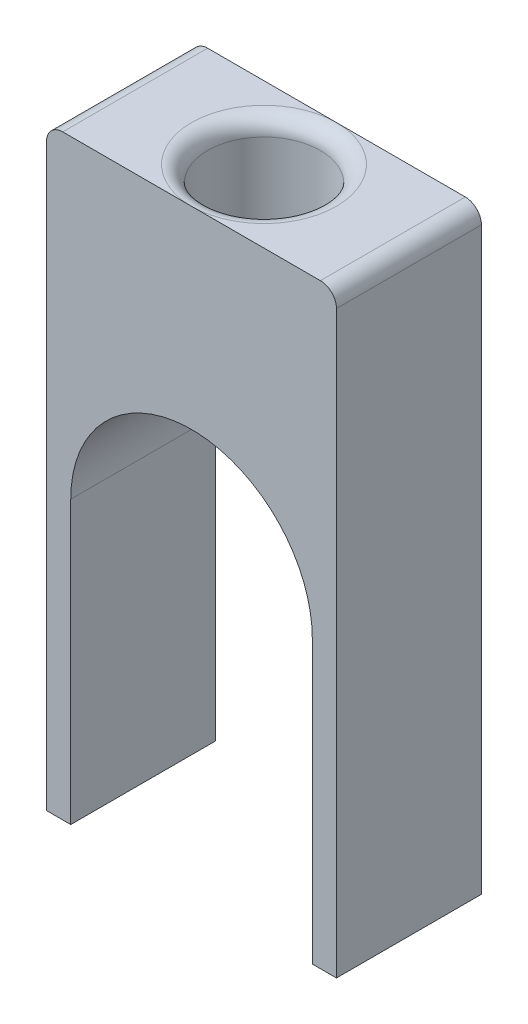
ISO-10303-21;
HEADER;
FILE_DESCRIPTION(('STEP AP214'),'2;1');
FILE_NAME('part.step','',(''),(''),'','','');
FILE_SCHEMA(('AUTOMOTIVE_DESIGN { 1 0 10303 214 1 1 1 1 }'));
ENDSEC;
DATA;
#1=APPLICATION_CONTEXT('core data for automotive mechanical design processes');
#2=APPLICATION_PROTOCOL_DEFINITION('international standard','automotive_design',2000,#1);
#3=PRODUCT_CONTEXT('',#1,'mechanical');
#4=PRODUCT('Part','Part','',(#3));
#5=PRODUCT_RELATED_PRODUCT_CATEGORY('part','',(#4));
#6=PRODUCT_DEFINITION_FORMATION('','',#4);
#7=PRODUCT_DEFINITION_CONTEXT('part definition',#1,'design');
#8=PRODUCT_DEFINITION('design','',#6,#7);
#9=PRODUCT_DEFINITION_SHAPE('','',#8);
#10=(LENGTH_UNIT() NAMED_UNIT(*) SI_UNIT(.MILLI.,.METRE.));
#11=(NAMED_UNIT(*) PLANE_ANGLE_UNIT() SI_UNIT($,.RADIAN.));
#12=(NAMED_UNIT(*) SI_UNIT($,.STERADIAN.) SOLID_ANGLE_UNIT());
#13=UNCERTAINTY_MEASURE_WITH_UNIT(LENGTH_MEASURE(1.E-05),#10,'distance_accuracy_value','');
#14=(GEOMETRIC_REPRESENTATION_CONTEXT(3) GLOBAL_UNCERTAINTY_ASSIGNED_CONTEXT((#13)) GLOBAL_UNIT_ASSIGNED_CONTEXT((#10,
#11,#12)) REPRESENTATION_CONTEXT('',''));
#15=CARTESIAN_POINT('',(0.,0.,0.));
#16=DIRECTION('',(0.,0.,1.));
#17=DIRECTION('',(1.,0.,0.));
#18=AXIS2_PLACEMENT_3D('',#15,#16,#17);
#19=CARTESIAN_POINT('',(0.,74.,18.));
#20=DIRECTION('',(0.,1.,0.));
#21=DIRECTION('',(0.,0.,1.));
#22=AXIS2_PLACEMENT_3D('',#19,#20,#21);
#23=PLANE('',#22);
#24=DIRECTION('',(1.,0.,0.));
#25=VECTOR('',#24,1.);
#26=CARTESIAN_POINT('',(0.,74.,0.));
#27=LINE('',#26,#25);
#28=CARTESIAN_POINT('',(-34.,74.,0.));
#29=VERTEX_POINT('',#28);
#30=CARTESIAN_POINT('',(-18.,74.,0.));
#31=VERTEX_POINT('',#30);
#32=EDGE_CURVE('E172',#29,#31,#27,.T.);
#33=ORIENTED_EDGE('',*,*,#32,.F.);
#34=DIRECTION('',(0.,0.,-1.));
#35=VECTOR('',#34,1.);
#36=CARTESIAN_POINT('',(-34.,74.,18.));
#37=LINE('',#36,#35);
#38=CARTESIAN_POINT('',(-34.,74.,18.));
#39=VERTEX_POINT('',#38);
#40=EDGE_CURVE('E12',#29,#39,#37,.F.);
#41=ORIENTED_EDGE('',*,*,#40,.T.);
#42=DIRECTION('',(1.,0.,0.));
#43=VECTOR('',#42,1.);
#44=CARTESIAN_POINT('',(0.,74.,18.));
#45=LINE('',#44,#43);
#46=CARTESIAN_POINT('',(-18.,74.,18.));
#47=VERTEX_POINT('',#46);
#48=EDGE_CURVE('E177',#39,#47,#45,.T.);
#49=ORIENTED_EDGE('',*,*,#48,.T.);
#50=CARTESIAN_POINT('',(-18.,74.,9.));
#51=DIRECTION('',(0.,1.,0.));
#52=DIRECTION('',(0.,0.,1.));
#53=AXIS2_PLACEMENT_3D('',#50,#51,#52);
#54=CIRCLE('',#53,9.);
#55=EDGE_CURVE('E200',#47,#31,#54,.F.);
#56=ORIENTED_EDGE('',*,*,#55,.T.);
#57=EDGE_LOOP('',(#33,#41,#49,#56));
#58=FACE_BOUND('',#57,.T.);
#59=ADVANCED_FACE('F59',(#58),#23,.T.);
#60=CARTESIAN_POINT('',(0.,0.,18.));
#61=DIRECTION('',(0.,1.,0.));
#62=DIRECTION('',(0.,0.,1.));
#63=AXIS2_PLACEMENT_3D('',#60,#61,#62);
#64=PLANE('',#63);
#65=DIRECTION('',(0.,0.,-1.));
#66=VECTOR('',#65,1.);
#67=CARTESIAN_POINT('',(-33.,0.,18.));
#68=LINE('',#67,#66);
#69=CARTESIAN_POINT('',(-33.,0.,18.));
#70=VERTEX_POINT('',#69);
#71=CARTESIAN_POINT('',(-33.,0.,0.));
#72=VERTEX_POINT('',#71);
#73=EDGE_CURVE('E152',#70,#72,#68,.T.);
#74=ORIENTED_EDGE('',*,*,#73,.F.);
#75=DIRECTION('',(1.,0.,0.));
#76=VECTOR('',#75,1.);
#77=CARTESIAN_POINT('',(0.,0.,18.));
#78=LINE('',#77,#76);
#79=CARTESIAN_POINT('',(-36.,0.,18.));
#80=VERTEX_POINT('',#79);
#81=EDGE_CURVE('E167',#80,#70,#78,.T.);
#82=ORIENTED_EDGE('',*,*,#81,.F.);
#83=DIRECTION('',(0.,0.,-1.));
#84=VECTOR('',#83,1.);
#85=CARTESIAN_POINT('',(-36.,0.,18.));
#86=LINE('',#85,#84);
#87=CARTESIAN_POINT('',(-36.,0.,0.));
#88=VERTEX_POINT('',#87);
#89=EDGE_CURVE('E191',#80,#88,#86,.T.);
#90=ORIENTED_EDGE('',*,*,#89,.T.);
#91=DIRECTION('',(1.,0.,0.));
#92=VECTOR('',#91,1.);
#93=CARTESIAN_POINT('',(0.,0.,0.));
#94=LINE('',#93,#92);
#95=EDGE_CURVE('E183',#88,#72,#94,.T.);
#96=ORIENTED_EDGE('',*,*,#95,.T.);
#97=EDGE_LOOP('',(#74,#82,#90,#96));
#98=FACE_BOUND('',#97,.T.);
#99=ADVANCED_FACE('F232',(#98),#64,.F.);
#100=CARTESIAN_POINT('',(-36.,0.,18.));
#101=DIRECTION('',(1.,0.,0.));
#102=DIRECTION('',(0.,0.,-1.));
#103=AXIS2_PLACEMENT_3D('',#100,#101,#102);
#104=PLANE('',#103);
#105=DIRECTION('',(0.,-1.,0.));
#106=VECTOR('',#105,1.);
#107=CARTESIAN_POINT('',(-36.,0.,18.));
#108=LINE('',#107,#106);
#109=CARTESIAN_POINT('',(-36.,72.,18.));
#110=VERTEX_POINT('',#109);
#111=EDGE_CURVE('E168',#110,#80,#108,.T.);
#112=ORIENTED_EDGE('',*,*,#111,.F.);
#113=DIRECTION('',(0.,0.,-1.));
#114=VECTOR('',#113,1.);
#115=CARTESIAN_POINT('',(-36.,72.,0.));
#116=LINE('',#115,#114);
#117=CARTESIAN_POINT('',(-36.,72.,0.));
#118=VERTEX_POINT('',#117);
#119=EDGE_CURVE('E67',#110,#118,#116,.T.);
#120=ORIENTED_EDGE('',*,*,#119,.T.);
#121=DIRECTION('',(0.,-1.,0.));
#122=VECTOR('',#121,1.);
#123=CARTESIAN_POINT('',(-36.,0.,0.));
#124=LINE('',#123,#122);
#125=EDGE_CURVE('E179',#118,#88,#124,.T.);
#126=ORIENTED_EDGE('',*,*,#125,.T.);
#127=ORIENTED_EDGE('',*,*,#89,.F.);
#128=EDGE_LOOP('',(#112,#120,#126,#127));
#129=FACE_BOUND('',#128,.T.);
#130=ADVANCED_FACE('F218',(#129),#104,.F.);
#131=CARTESIAN_POINT('',(-3.00000000000001,0.,18.));
#132=VERTEX_POINT('',#131);
#133=CARTESIAN_POINT('',(0.,0.,18.));
#134=VERTEX_POINT('',#133);
#135=EDGE_CURVE('E158',#132,#134,#78,.T.);
#136=ORIENTED_EDGE('',*,*,#135,.F.);
#137=DIRECTION('',(0.,0.,-1.));
#138=VECTOR('',#137,1.);
#139=CARTESIAN_POINT('',(-3.00000000000001,0.,18.));
#140=LINE('',#139,#138);
#141=CARTESIAN_POINT('',(-3.00000000000001,0.,0.));
#142=VERTEX_POINT('',#141);
#143=EDGE_CURVE('E141',#132,#142,#140,.T.);
#144=ORIENTED_EDGE('',*,*,#143,.T.);
#145=CARTESIAN_POINT('',(0.,0.,0.));
#146=VERTEX_POINT('',#145);
#147=EDGE_CURVE('E181',#142,#146,#94,.T.);
#148=ORIENTED_EDGE('',*,*,#147,.T.);
#149=DIRECTION('',(0.,0.,-1.));
#150=VECTOR('',#149,1.);
#151=CARTESIAN_POINT('',(0.,0.,18.));
#152=LINE('',#151,#150);
#153=EDGE_CURVE('E166',#134,#146,#152,.T.);
#154=ORIENTED_EDGE('',*,*,#153,.F.);
#155=EDGE_LOOP('',(#136,#144,#148,#154));
#156=FACE_BOUND('',#155,.T.);
#157=ADVANCED_FACE('F164',(#156),#64,.F.);
#158=CARTESIAN_POINT('',(0.,0.,18.));
#159=DIRECTION('',(1.,0.,0.));
#160=DIRECTION('',(0.,0.,-1.));
#161=AXIS2_PLACEMENT_3D('',#158,#159,#160);
#162=PLANE('',#161);
#163=DIRECTION('',(0.,-1.,0.));
#164=VECTOR('',#163,1.);
#165=CARTESIAN_POINT('',(0.,0.,0.));
#166=LINE('',#165,#164);
#167=CARTESIAN_POINT('',(0.,72.,0.));
#168=VERTEX_POINT('',#167);
#169=EDGE_CURVE('E186',#168,#146,#166,.T.);
#170=ORIENTED_EDGE('',*,*,#169,.F.);
#171=DIRECTION('',(0.,0.,-1.));
#172=VECTOR('',#171,1.);
#173=CARTESIAN_POINT('',(0.,72.,18.));
#174=LINE('',#173,#172);
#175=CARTESIAN_POINT('',(0.,72.,18.));
#176=VERTEX_POINT('',#175);
#177=EDGE_CURVE('E210',#168,#176,#174,.F.);
#178=ORIENTED_EDGE('',*,*,#177,.T.);
#179=DIRECTION('',(0.,-1.,0.));
#180=VECTOR('',#179,1.);
#181=CARTESIAN_POINT('',(0.,0.,18.));
#182=LINE('',#181,#180);
#183=EDGE_CURVE('E171',#176,#134,#182,.T.);
#184=ORIENTED_EDGE('',*,*,#183,.T.);
#185=ORIENTED_EDGE('',*,*,#153,.T.);
#186=EDGE_LOOP('',(#170,#178,#184,#185));
#187=FACE_BOUND('',#186,.T.);
#188=ADVANCED_FACE('F274',(#187),#162,.T.);
#189=CARTESIAN_POINT('',(-2.,74.,18.));
#190=VERTEX_POINT('',#189);
#191=EDGE_CURVE('E176',#47,#190,#45,.T.);
#192=ORIENTED_EDGE('',*,*,#191,.T.);
#193=DIRECTION('',(0.,0.,-1.));
#194=VECTOR('',#193,1.);
#195=CARTESIAN_POINT('',(-2.,74.,18.));
#196=LINE('',#195,#194);
#197=CARTESIAN_POINT('',(-2.,74.,0.));
#198=VERTEX_POINT('',#197);
#199=EDGE_CURVE('E203',#190,#198,#196,.T.);
#200=ORIENTED_EDGE('',*,*,#199,.T.);
#201=EDGE_CURVE('E188',#31,#198,#27,.T.);
#202=ORIENTED_EDGE('',*,*,#201,.F.);
#203=CARTESIAN_POINT('',(-18.,74.,9.));
#204=DIRECTION('',(0.,1.,0.));
#205=DIRECTION('',(0.,0.,1.));
#206=AXIS2_PLACEMENT_3D('',#203,#204,#205);
#207=CIRCLE('',#206,9.);
#208=EDGE_CURVE('E197',#31,#47,#207,.F.);
#209=ORIENTED_EDGE('',*,*,#208,.T.);
#210=EDGE_LOOP('',(#192,#200,#202,#209));
#211=FACE_BOUND('',#210,.T.);
#212=ADVANCED_FACE('F264',(#211),#23,.T.);
#213=CARTESIAN_POINT('',(0.,0.,18.));
#214=DIRECTION('',(0.,0.,1.));
#215=DIRECTION('',(1.,0.,0.));
#216=AXIS2_PLACEMENT_3D('',#213,#214,#215);
#217=PLANE('',#216);
#218=ORIENTED_EDGE('',*,*,#183,.F.);
#219=CARTESIAN_POINT('',(-2.,72.,18.));
#220=DIRECTION('',(0.,0.,1.));
#221=DIRECTION('',(1.,0.,0.));
#222=AXIS2_PLACEMENT_3D('',#219,#220,#221);
#223=CIRCLE('',#222,2.);
#224=EDGE_CURVE('E213',#176,#190,#223,.T.);
#225=ORIENTED_EDGE('',*,*,#224,.T.);
#226=ORIENTED_EDGE('',*,*,#191,.F.);
#227=ORIENTED_EDGE('',*,*,#48,.F.);
#228=CARTESIAN_POINT('',(-34.,72.,18.));
#229=DIRECTION('',(0.,0.,1.));
#230=DIRECTION('',(1.,0.,0.));
#231=AXIS2_PLACEMENT_3D('',#228,#229,#230);
#232=CIRCLE('',#231,2.);
#233=EDGE_CURVE('E74',#39,#110,#232,.T.);
#234=ORIENTED_EDGE('',*,*,#233,.T.);
#235=ORIENTED_EDGE('',*,*,#111,.T.);
#236=ORIENTED_EDGE('',*,*,#81,.T.);
#237=DIRECTION('',(0.,-1.,0.));
#238=VECTOR('',#237,1.);
#239=CARTESIAN_POINT('',(-33.,35.,18.));
#240=LINE('',#239,#238);
#241=CARTESIAN_POINT('',(-33.,35.,18.));
#242=VERTEX_POINT('',#241);
#243=EDGE_CURVE('E161',#242,#70,#240,.T.);
#244=ORIENTED_EDGE('',*,*,#243,.F.);
#245=CARTESIAN_POINT('',(-18.,35.,18.));
#246=DIRECTION('',(0.,0.,1.));
#247=DIRECTION('',(1.,0.,0.));
#248=AXIS2_PLACEMENT_3D('',#245,#246,#247);
#249=CIRCLE('',#248,15.);
#250=CARTESIAN_POINT('',(-3.00000000000001,35.,18.));
#251=VERTEX_POINT('',#250);
#252=EDGE_CURVE('E153',#251,#242,#249,.T.);
#253=ORIENTED_EDGE('',*,*,#252,.F.);
#254=DIRECTION('',(0.,-1.,0.));
#255=VECTOR('',#254,1.);
#256=CARTESIAN_POINT('',(-3.00000000000001,35.,18.));
#257=LINE('',#256,#255);
#258=EDGE_CURVE('E144',#251,#132,#257,.T.);
#259=ORIENTED_EDGE('',*,*,#258,.T.);
#260=ORIENTED_EDGE('',*,*,#135,.T.);
#261=EDGE_LOOP('',(#218,#225,#226,#227,#234,#235,#236,#244,#253,#259,#260));
#262=FACE_BOUND('',#261,.T.);
#263=ADVANCED_FACE('F157',(#262),#217,.T.);
#264=CARTESIAN_POINT('',(0.,0.,0.));
#265=DIRECTION('',(0.,0.,1.));
#266=DIRECTION('',(1.,0.,0.));
#267=AXIS2_PLACEMENT_3D('',#264,#265,#266);
#268=PLANE('',#267);
#269=ORIENTED_EDGE('',*,*,#201,.T.);
#270=CARTESIAN_POINT('',(-2.,72.,0.));
#271=DIRECTION('',(0.,0.,1.));
#272=DIRECTION('',(1.,0.,0.));
#273=AXIS2_PLACEMENT_3D('',#270,#271,#272);
#274=CIRCLE('',#273,2.);
#275=EDGE_CURVE('E208',#198,#168,#274,.F.);
#276=ORIENTED_EDGE('',*,*,#275,.T.);
#277=ORIENTED_EDGE('',*,*,#169,.T.);
#278=ORIENTED_EDGE('',*,*,#147,.F.);
#279=DIRECTION('',(0.,-1.,0.));
#280=VECTOR('',#279,1.);
#281=CARTESIAN_POINT('',(-3.00000000000001,35.,0.));
#282=LINE('',#281,#280);
#283=CARTESIAN_POINT('',(-3.00000000000001,35.,0.));
#284=VERTEX_POINT('',#283);
#285=EDGE_CURVE('E147',#284,#142,#282,.T.);
#286=ORIENTED_EDGE('',*,*,#285,.F.);
#287=CARTESIAN_POINT('',(-18.,35.,0.));
#288=DIRECTION('',(0.,0.,1.));
#289=DIRECTION('',(1.,0.,0.));
#290=AXIS2_PLACEMENT_3D('',#287,#288,#289);
#291=CIRCLE('',#290,15.);
#292=CARTESIAN_POINT('',(-33.,35.,0.));
#293=VERTEX_POINT('',#292);
#294=EDGE_CURVE('E162',#284,#293,#291,.T.);
#295=ORIENTED_EDGE('',*,*,#294,.T.);
#296=DIRECTION('',(0.,-1.,0.));
#297=VECTOR('',#296,1.);
#298=CARTESIAN_POINT('',(-33.,35.,0.));
#299=LINE('',#298,#297);
#300=EDGE_CURVE('E228',#293,#72,#299,.T.);
#301=ORIENTED_EDGE('',*,*,#300,.T.);
#302=ORIENTED_EDGE('',*,*,#95,.F.);
#303=ORIENTED_EDGE('',*,*,#125,.F.);
#304=CARTESIAN_POINT('',(-34.,72.,0.));
#305=DIRECTION('',(0.,0.,1.));
#306=DIRECTION('',(1.,0.,0.));
#307=AXIS2_PLACEMENT_3D('',#304,#305,#306);
#308=CIRCLE('',#307,2.);
#309=EDGE_CURVE('E206',#118,#29,#308,.F.);
#310=ORIENTED_EDGE('',*,*,#309,.T.);
#311=ORIENTED_EDGE('',*,*,#32,.T.);
#312=EDGE_LOOP('',(#269,#276,#277,#278,#286,#295,#301,#302,#303,#310,#311));
#313=FACE_BOUND('',#312,.T.);
#314=ADVANCED_FACE('F224',(#313),#268,.F.);
#315=CARTESIAN_POINT('',(-3.00000000000001,35.,18.));
#316=DIRECTION('',(1.,0.,0.));
#317=DIRECTION('',(0.,0.,-1.));
#318=AXIS2_PLACEMENT_3D('',#315,#316,#317);
#319=PLANE('',#318);
#320=ORIENTED_EDGE('',*,*,#285,.T.);
#321=ORIENTED_EDGE('',*,*,#143,.F.);
#322=ORIENTED_EDGE('',*,*,#258,.F.);
#323=DIRECTION('',(0.,0.,-1.));
#324=VECTOR('',#323,1.);
#325=CARTESIAN_POINT('',(-3.00000000000001,35.,18.));
#326=LINE('',#325,#324);
#327=EDGE_CURVE('E182',#251,#284,#326,.T.);
#328=ORIENTED_EDGE('',*,*,#327,.T.);
#329=EDGE_LOOP('',(#320,#321,#322,#328));
#330=FACE_BOUND('',#329,.T.);
#331=ADVANCED_FACE('F143',(#330),#319,.F.);
#332=CARTESIAN_POINT('',(-18.,35.,18.));
#333=DIRECTION('',(0.,0.,-1.));
#334=DIRECTION('',(-1.,0.,0.));
#335=AXIS2_PLACEMENT_3D('',#332,#333,#334);
#336=CYLINDRICAL_SURFACE('',#335,15.);
#337=CARTESIAN_POINT('',(-18.,50.,16.));
#338=CARTESIAN_POINT('',(-17.8144724903543,49.9999989062768,15.9999987311845));
#339=CARTESIAN_POINT('',(-17.6289108404347,49.9965492462378,15.9926149496319));
#340=CARTESIAN_POINT('',(-17.259135311178,49.9828363155982,15.963156568287));
#341=CARTESIAN_POINT('',(-17.0749221814709,49.9725695089819,15.9410743444807));
#342=CARTESIAN_POINT('',(-16.7089841349934,49.9454673410377,15.8824175764527));
#343=CARTESIAN_POINT('',(-16.5272640099452,49.928620781231,15.8458183231612));
#344=CARTESIAN_POINT('',(-16.1678623326587,49.8887870557922,15.7585122416939));
#345=CARTESIAN_POINT('',(-15.9901824650756,49.8657973778409,15.7077996413029));
#346=CARTESIAN_POINT('',(-15.6408411168908,49.8143651145563,15.5930291161196));
#347=CARTESIAN_POINT('',(-15.4691577014083,49.7859455779182,15.5290275043861));
#348=CARTESIAN_POINT('',(-15.1320074611391,49.7242659158824,15.3881154617424));
#349=CARTESIAN_POINT('',(-14.9665430296055,49.6910039504898,15.3112001222469));
#350=CARTESIAN_POINT('',(-14.6428928731725,49.6204390462863,15.1451512914262));
#351=CARTESIAN_POINT('',(-14.4847027443468,49.5831385995459,15.0560253261356));
#352=CARTESIAN_POINT('',(-14.1762576307084,49.5053212671914,14.8661597675412));
#353=CARTESIAN_POINT('',(-14.0260055707253,49.4648032096043,14.7654159364829));
#354=CARTESIAN_POINT('',(-13.5723982906027,49.3352174768163,14.4351670235891));
#355=CARTESIAN_POINT('',(-13.2837624770057,49.2420761526874,14.1866208200334));
#356=CARTESIAN_POINT('',(-12.7505628682364,49.0543075209071,13.6462489954088));
#357=CARTESIAN_POINT('',(-12.5060280884725,48.9596792791476,13.3543951093714));
#358=CARTESIAN_POINT('',(-12.1692458894956,48.8209401738483,12.8785879777553));
#359=CARTESIAN_POINT('',(-12.0591933743071,48.7738664925622,12.7078579282309));
#360=CARTESIAN_POINT('',(-11.8539814848708,48.6835306533337,12.3567480796531));
#361=CARTESIAN_POINT('',(-11.7588159187729,48.640266914032,12.1763723345952));
#362=CARTESIAN_POINT('',(-11.5842320056339,48.5590265354511,11.8070684944977));
#363=CARTESIAN_POINT('',(-11.5048095728275,48.5210485251475,11.6181426341175));
#364=CARTESIAN_POINT('',(-11.3625294491343,48.451775124541,11.2329619451478));
#365=CARTESIAN_POINT('',(-11.2996701711392,48.4204790940145,11.0367078208234));
#366=CARTESIAN_POINT('',(-11.1943291741414,48.3673531698136,10.6494932833254));
#367=CARTESIAN_POINT('',(-11.1509064716103,48.3450926725968,10.4588480946643));
#368=CARTESIAN_POINT('',(-11.0800897669681,48.308509999873,10.0738452185197));
#369=CARTESIAN_POINT('',(-11.0526951604446,48.2941875250276,9.87948767131311));
#370=CARTESIAN_POINT('',(-11.0143346001328,48.2740706095154,9.4888472013927));
#371=CARTESIAN_POINT('',(-11.0033576736239,48.268270473008,9.29256565297039));
#372=CARTESIAN_POINT('',(-10.9979628601536,48.2654245810255,8.89971851980438));
#373=CARTESIAN_POINT('',(-11.0035437268629,48.2683781666449,8.70315295755201));
#374=CARTESIAN_POINT('',(-11.0297749517005,48.2821739666281,8.33133975246732));
#375=CARTESIAN_POINT('',(-11.048844001363,48.2921880639042,8.15594684775974));
#376=CARTESIAN_POINT('',(-11.1000696671764,48.3188511388526,7.80753469158967));
#377=CARTESIAN_POINT('',(-11.132230683858,48.3355023473812,7.63451625847838));
#378=CARTESIAN_POINT('',(-11.2092830358291,48.3749029758743,7.29208944033967));
#379=CARTESIAN_POINT('',(-11.2541720309192,48.3976512747697,7.12268039783069));
#380=CARTESIAN_POINT('',(-11.3562560844524,48.4485656794008,6.78838761974696));
#381=CARTESIAN_POINT('',(-11.4134559396177,48.476733896463,6.62350567639755));
#382=CARTESIAN_POINT('',(-11.5410925981186,48.5383766583609,6.29552875500583));
#383=CARTESIAN_POINT('',(-11.6117997215619,48.5719568830626,6.13255870779857));
#384=CARTESIAN_POINT('',(-11.7649931003743,48.6430140070596,5.81313368756305));
#385=CARTESIAN_POINT('',(-11.847483297425,48.6804922091636,5.65668091741101));
#386=CARTESIAN_POINT('',(-12.111883257174,48.7973596666347,5.19810690542785));
#387=CARTESIAN_POINT('',(-12.3107856941847,48.8812136856748,4.90660842705447));
#388=CARTESIAN_POINT('',(-12.6513180373986,49.0145878791314,4.48008319514176));
#389=CARTESIAN_POINT('',(-12.7790245294469,49.062774006816,4.33316946029705));
#390=CARTESIAN_POINT('',(-13.0462296024235,49.1591066274215,4.0504618618073));
#391=CARTESIAN_POINT('',(-13.1857250243727,49.2072531274913,3.91466503833858));
#392=CARTESIAN_POINT('',(-13.4758823934247,49.3022965716615,3.65487840277979));
#393=CARTESIAN_POINT('',(-13.626552407589,49.3491925791524,3.53089727104321));
#394=CARTESIAN_POINT('',(-13.9381453655387,49.4404874529307,3.29566653621278));
#395=CARTESIAN_POINT('',(-14.0990642011653,49.4848873065116,3.18441188119369));
#396=CARTESIAN_POINT('',(-14.4363555064618,49.5716107423194,2.97159845626735));
#397=CARTESIAN_POINT('',(-14.6130765428049,49.6138009529048,2.87053656145541));
#398=CARTESIAN_POINT('',(-14.9754904734718,49.6930843662266,2.68384062940458));
#399=CARTESIAN_POINT('',(-15.1611793460062,49.7301798256273,2.59819975632945));
#400=CARTESIAN_POINT('',(-15.5402645986457,49.7982015015905,2.44320063761778));
#401=CARTESIAN_POINT('',(-15.7336584964581,49.8291296860587,2.37383719678827));
#402=CARTESIAN_POINT('',(-16.1267169396255,49.8838894885933,2.25217654360744));
#403=CARTESIAN_POINT('',(-16.3263808661658,49.9077218045617,2.19987765285264));
#404=CARTESIAN_POINT('',(-16.7150935708123,49.9460444220633,2.11628636906312));
#405=CARTESIAN_POINT('',(-16.9038108855109,49.9611026527104,2.08370962358555));
#406=CARTESIAN_POINT('',(-17.2837084004173,49.9840958549318,2.03411066061369));
#407=CARTESIAN_POINT('',(-17.4748884776144,49.9920311808939,2.01708766926839));
#408=CARTESIAN_POINT('',(-17.8581006358246,50.0005528438796,1.99881076929322));
#409=CARTESIAN_POINT('',(-18.0501324143964,50.0011416086632,1.9975516513001));
#410=CARTESIAN_POINT('',(-18.4335280422512,49.9949593473442,2.01080539431755));
#411=CARTESIAN_POINT('',(-18.6248919139736,49.9881885709307,2.02531772024613));
#412=CARTESIAN_POINT('',(-18.9928708344438,49.9681629903725,2.06846060257583));
#413=CARTESIAN_POINT('',(-19.169628166118,49.9553639048463,2.09609987965404));
#414=CARTESIAN_POINT('',(-19.5200595094423,49.9238191531151,2.16470144607146));
#415=CARTESIAN_POINT('',(-19.6937324410644,49.9050714456742,2.20566830881837));
#416=CARTESIAN_POINT('',(-20.0367577183847,49.8620823178559,2.30050187252136));
#417=CARTESIAN_POINT('',(-20.2061113773966,49.8378425900775,2.35436459935943));
#418=CARTESIAN_POINT('',(-20.5396072433998,49.7844151696283,2.47452478760405));
#419=CARTESIAN_POINT('',(-20.7037474303026,49.7552255861255,2.54082700189594));
#420=CARTESIAN_POINT('',(-21.030736760353,49.6916030220054,2.68749655585051));
#421=CARTESIAN_POINT('',(-21.193396832886,49.6570381953359,2.7682285317781));
#422=CARTESIAN_POINT('',(-21.5113451762473,49.584138843629,2.94167648843356));
#423=CARTESIAN_POINT('',(-21.6666307162628,49.5458029380419,3.03439686191408));
#424=CARTESIAN_POINT('',(-22.1202318250542,49.4264075499976,3.32957304653616));
#425=CARTESIAN_POINT('',(-22.4064664376566,49.3409250342679,3.54912277200806));
#426=CARTESIAN_POINT('',(-22.9647193083283,49.1578733053259,4.04982570939146));
#427=CARTESIAN_POINT('',(-23.2332819685322,49.0599018903553,4.33469554291427));
#428=CARTESIAN_POINT('',(-23.5982197421826,48.9167925594408,4.79307552483794));
#429=CARTESIAN_POINT('',(-23.7136215184732,48.8696962817171,4.95118059841928));
#430=CARTESIAN_POINT('',(-23.9310734205115,48.7781079674164,5.27700624060715));
#431=CARTESIAN_POINT('',(-24.033128713024,48.733614926768,5.44472305188471));
#432=CARTESIAN_POINT('',(-24.2262888073018,48.6471574298561,5.79460207257833));
#433=CARTESIAN_POINT('',(-24.316920401343,48.605325087148,5.97705847048482));
#434=CARTESIAN_POINT('',(-24.4822648610648,48.5273278724206,6.35012418382778));
#435=CARTESIAN_POINT('',(-24.5569852987634,48.4911603067471,6.54072956912096));
#436=CARTESIAN_POINT('',(-24.6896795774641,48.4258579093784,6.9287219343606));
#437=CARTESIAN_POINT('',(-24.7476645817498,48.3967183918025,7.12610429496493));
#438=CARTESIAN_POINT('',(-24.8461896222493,48.3466383139003,7.5261908368335));
#439=CARTESIAN_POINT('',(-24.8867319156738,48.3256966927398,7.72889432590171));
#440=CARTESIAN_POINT('',(-24.9469356843971,48.2944019582038,8.11936519030305));
#441=CARTESIAN_POINT('',(-24.9681502718332,48.2832643862308,8.30683137066227));
#442=CARTESIAN_POINT('',(-24.9953698324469,48.2689503293364,8.68316551134626));
#443=CARTESIAN_POINT('',(-25.0013757627906,48.2657733434107,8.87203338270439));
#444=CARTESIAN_POINT('',(-24.9980962778897,48.2675035477491,9.2495502626916));
#445=CARTESIAN_POINT('',(-24.9888145749873,48.2724087753849,9.43819931332611));
#446=CARTESIAN_POINT('',(-24.9550945698945,48.290109888523,9.8137582576));
#447=CARTESIAN_POINT('',(-24.9306566294976,48.3029055856724,10.0006681926456));
#448=CARTESIAN_POINT('',(-24.8692843881236,48.3346925888752,10.3576820992102));
#449=CARTESIAN_POINT('',(-24.8333964414475,48.3531614744204,10.5280143144271));
#450=CARTESIAN_POINT('',(-24.7492425920505,48.3958930302163,10.8649072716243));
#451=CARTESIAN_POINT('',(-24.7009725005989,48.4201576609062,11.0314667165299));
#452=CARTESIAN_POINT('',(-24.5925196098735,48.4737648408456,11.3597822526532));
#453=CARTESIAN_POINT('',(-24.5323385835551,48.5031066342723,11.5215390546333));
#454=CARTESIAN_POINT('',(-24.4005287573588,48.566081427855,11.839518895929));
#455=CARTESIAN_POINT('',(-24.3288955453449,48.5997160808917,11.9957397739882));
#456=CARTESIAN_POINT('',(-24.1696221549088,48.6727441336945,12.3119684241976));
#457=CARTESIAN_POINT('',(-24.0812384009807,48.7123709267442,12.4715478116527));
#458=CARTESIAN_POINT('',(-23.8926377344072,48.7944698641418,12.7828501854864));
#459=CARTESIAN_POINT('',(-23.7924167721296,48.8369429800842,12.9345704574946));
#460=CARTESIAN_POINT('',(-23.5807317216298,48.9236674839918,13.2294661262661));
#461=CARTESIAN_POINT('',(-23.4692651189406,48.9679192683215,13.3726396005683));
#462=CARTESIAN_POINT('',(-23.2356806677691,49.0571433668396,13.6497844475505));
#463=CARTESIAN_POINT('',(-23.1135621530116,49.1021157259559,13.7837552436662));
#464=CARTESIAN_POINT('',(-22.8464368057593,49.1962694508257,14.0548804671891));
#465=CARTESIAN_POINT('',(-22.7003634060584,49.2454187789171,14.1909977280873));
#466=CARTESIAN_POINT('',(-22.3968457119163,49.3420047892902,14.4504676910772));
#467=CARTESIAN_POINT('',(-22.2394049941334,49.3894420032928,14.5738243787442));
#468=CARTESIAN_POINT('',(-21.9138063118185,49.4813935477573,14.8070870710599));
#469=CARTESIAN_POINT('',(-21.745638492954,49.525905112131,14.916980429089));
#470=CARTESIAN_POINT('',(-21.3997600365314,49.6107261253301,15.1222587440049));
#471=CARTESIAN_POINT('',(-21.2220538576611,49.6510375120433,15.2176504011302));
#472=CARTESIAN_POINT('',(-20.8590097550195,49.7261758713317,15.3926892571868));
#473=CARTESIAN_POINT('',(-20.6737123544563,49.7610281291556,15.4724095083193));
#474=CARTESIAN_POINT('',(-20.2960619407038,49.8244639822681,15.615804406194));
#475=CARTESIAN_POINT('',(-20.1037124103785,49.853050624571,15.6794868544916));
#476=CARTESIAN_POINT('',(-19.7138088580431,49.9030669239484,15.7899797857096));
#477=CARTESIAN_POINT('',(-19.516268041036,49.9245131410752,15.8368293277295));
#478=CARTESIAN_POINT('',(-19.11729196079,49.9596693268297,15.9132383726008));
#479=CARTESIAN_POINT('',(-18.9158593682278,49.9733844185492,15.9428093257229));
#480=CARTESIAN_POINT('',(-18.5949750714916,49.9886652615981,15.9756855034334));
#481=CARTESIAN_POINT('',(-18.476212067356,49.9929110778711,15.9847985310425));
#482=CARTESIAN_POINT('',(-18.2383040749649,49.9985788264754,15.9969562473226));
#483=CARTESIAN_POINT('',(-18.119159079136,50.0000007024675,16.0000008149243));
#484=CARTESIAN_POINT('',(-18.,50.,16.));
#485=B_SPLINE_CURVE_WITH_KNOTS('',3,(#337,#338,#339,#340,#341,#342,#343,#344,#345,#346,#347,
#348,#349,#350,#351,#352,#353,#354,#355,#356,#357,#358,#359,#360,#361,#362,#363,#364,#365,#366,
#367,#368,#369,#370,#371,#372,#373,#374,#375,#376,#377,#378,#379,#380,#381,#382,#383,#384,#385,
#386,#387,#388,#389,#390,#391,#392,#393,#394,#395,#396,#397,#398,#399,#400,#401,#402,#403,#404,
#405,#406,#407,#408,#409,#410,#411,#412,#413,#414,#415,#416,#417,#418,#419,#420,#421,#422,#423,
#424,#425,#426,#427,#428,#429,#430,#431,#432,#433,#434,#435,#436,#437,#438,#439,#440,#441,#442,
#443,#444,#445,#446,#447,#448,#449,#450,#451,#452,#453,#454,#455,#456,#457,#458,#459,#460,#461,
#462,#463,#464,#465,#466,#467,#468,#469,#470,#471,#472,#473,#474,#475,#476,#477,#478,#479,#480,
#481,#482,#483,#484),.UNSPECIFIED.,.T.,.F.,(4,2,2,2,2,2,2,2,2,2,2,2,2,2,2,2,2,2,2,2,2,2,2,2,2,2,
2,2,2,2,2,2,2,2,2,2,2,2,2,2,2,2,2,2,2,2,2,2,2,2,2,2,2,2,2,2,2,2,2,2,2,2,2,2,2,2,2,2,2,2,2,2,2,
4),(0.,0.556463897382044,1.11321665517297,1.67092114244938,2.22885406123899,2.78446926592942,
3.34029614341329,3.89578196472597,4.45147105081952,5.62255040167629,6.7943974524586,
7.41925763509557,8.04385722793118,8.66829450757838,9.29267193086311,9.88222605810051,
10.4717579520758,11.0608956573529,11.6499890184992,12.1794981405363,12.7091853907006,
13.2387753142617,13.7685719585179,14.3103609351528,14.8523315777009,15.9357488970924,
16.5368462109868,17.1377829615941,17.7391578388527,18.3402931586925,18.9631926758349,
19.5858153904363,20.2082391143216,20.8306016005377,21.4061427166912,21.9816551962004,
22.556977485605,23.132280256506,23.6697472508524,24.2073988737646,24.7448850213768,
25.2825769517231,25.8365253406996,26.390677284073,27.4984032609551,28.7034024399018,
29.3068236619325,29.9100105882889,30.5331266643462,31.1559455374183,31.7783479971204,
32.4006698892832,32.9668805427281,33.5330555604721,34.0990931124935,34.6651171531917,
35.1896844187631,35.7144293736939,36.2390962784422,36.763965808717,37.3234087254229,
37.8830435907859,38.4428038661049,39.0025991794738,39.6187477336263,40.2347032581721,
40.8512330078131,41.4674770300147,42.0807765176619,42.6937770882811,43.3053459226826,
43.9165090182831,44.2739029318526,44.6313039755636),.UNSPECIFIED.);
#486=CARTESIAN_POINT('',(-18.,50.,16.));
#487=VERTEX_POINT('',#486);
#488=EDGE_CURVE('E240',#487,#487,#485,.T.);
#489=ORIENTED_EDGE('',*,*,#488,.T.);
#490=EDGE_LOOP('',(#489));
#491=FACE_BOUND('',#490,.T.);
#492=ORIENTED_EDGE('',*,*,#294,.F.);
#493=ORIENTED_EDGE('',*,*,#327,.F.);
#494=ORIENTED_EDGE('',*,*,#252,.T.);
#495=DIRECTION('',(0.,0.,-1.));
#496=VECTOR('',#495,1.);
#497=CARTESIAN_POINT('',(-33.,35.,18.));
#498=LINE('',#497,#496);
#499=EDGE_CURVE('E244',#242,#293,#498,.T.);
#500=ORIENTED_EDGE('',*,*,#499,.T.);
#501=EDGE_LOOP('',(#492,#493,#494,#500));
#502=FACE_BOUND('',#501,.T.);
#503=ADVANCED_FACE('F249',(#491,#502),#336,.F.);
#504=CARTESIAN_POINT('',(-33.,35.,18.));
#505=DIRECTION('',(1.,0.,0.));
#506=DIRECTION('',(0.,0.,-1.));
#507=AXIS2_PLACEMENT_3D('',#504,#505,#506);
#508=PLANE('',#507);
#509=ORIENTED_EDGE('',*,*,#300,.F.);
#510=ORIENTED_EDGE('',*,*,#499,.F.);
#511=ORIENTED_EDGE('',*,*,#243,.T.);
#512=ORIENTED_EDGE('',*,*,#73,.T.);
#513=EDGE_LOOP('',(#509,#510,#511,#512));
#514=FACE_BOUND('',#513,.T.);
#515=ADVANCED_FACE('F246',(#514),#508,.T.);
#516=CARTESIAN_POINT('',(-18.,-0.001000000000001,9.));
#517=DIRECTION('',(0.,1.,0.));
#518=DIRECTION('',(0.,0.,1.));
#519=AXIS2_PLACEMENT_3D('',#516,#517,#518);
#520=CYLINDRICAL_SURFACE('',#519,7.);
#521=CARTESIAN_POINT('',(-18.,72.,9.));
#522=DIRECTION('',(0.,1.,0.));
#523=DIRECTION('',(0.,0.,1.));
#524=AXIS2_PLACEMENT_3D('',#521,#522,#523);
#525=CIRCLE('',#524,7.);
#526=CARTESIAN_POINT('',(-18.,72.,16.));
#527=VERTEX_POINT('',#526);
#528=EDGE_CURVE('E194',#527,#527,#525,.T.);
#529=ORIENTED_EDGE('',*,*,#528,.T.);
#530=EDGE_LOOP('',(#529));
#531=FACE_BOUND('',#530,.T.);
#532=ORIENTED_EDGE('',*,*,#488,.F.);
#533=EDGE_LOOP('',(#532));
#534=FACE_BOUND('',#533,.T.);
#535=ADVANCED_FACE('F257',(#531,#534),#520,.F.);
#536=CARTESIAN_POINT('',(-18.,72.,9.));
#537=DIRECTION('',(0.,1.,0.));
#538=DIRECTION('',(0.,0.,1.));
#539=AXIS2_PLACEMENT_3D('',#536,#537,#538);
#540=TOROIDAL_SURFACE('',#539,9.,2.);
#541=ORIENTED_EDGE('',*,*,#208,.F.);
#542=ORIENTED_EDGE('',*,*,#55,.F.);
#543=EDGE_LOOP('',(#541,#542));
#544=FACE_BOUND('',#543,.T.);
#545=ORIENTED_EDGE('',*,*,#528,.F.);
#546=EDGE_LOOP('',(#545));
#547=FACE_BOUND('',#546,.T.);
#548=ADVANCED_FACE('F294',(#544,#547),#540,.T.);
#549=CARTESIAN_POINT('',(-2.,72.,18.));
#550=DIRECTION('',(0.,0.,-1.));
#551=DIRECTION('',(-1.,0.,0.));
#552=AXIS2_PLACEMENT_3D('',#549,#550,#551);
#553=CYLINDRICAL_SURFACE('',#552,2.);
#554=ORIENTED_EDGE('',*,*,#224,.F.);
#555=ORIENTED_EDGE('',*,*,#177,.F.);
#556=ORIENTED_EDGE('',*,*,#275,.F.);
#557=ORIENTED_EDGE('',*,*,#199,.F.);
#558=EDGE_LOOP('',(#554,#555,#556,#557));
#559=FACE_BOUND('',#558,.T.);
#560=ADVANCED_FACE('F290',(#559),#553,.T.);
#561=CARTESIAN_POINT('',(-34.,72.,18.));
#562=DIRECTION('',(0.,0.,1.));
#563=DIRECTION('',(1.,0.,0.));
#564=AXIS2_PLACEMENT_3D('',#561,#562,#563);
#565=CYLINDRICAL_SURFACE('',#564,2.);
#566=ORIENTED_EDGE('',*,*,#233,.F.);
#567=ORIENTED_EDGE('',*,*,#40,.F.);
#568=ORIENTED_EDGE('',*,*,#309,.F.);
#569=ORIENTED_EDGE('',*,*,#119,.F.);
#570=EDGE_LOOP('',(#566,#567,#568,#569));
#571=FACE_BOUND('',#570,.T.);
#572=ADVANCED_FACE('F61',(#571),#565,.T.);
#573=CLOSED_SHELL('',(#59,#99,#130,#157,#188,#212,#263,#314,#331,#503,#515,#535,#548,#560,#572));
#574=MANIFOLD_SOLID_BREP('B2',#573);
#575=ADVANCED_BREP_SHAPE_REPRESENTATION('',(#18,#574),#14);
#576=SHAPE_DEFINITION_REPRESENTATION(#9,#575);
ENDSEC;
END-ISO-10303-21;
